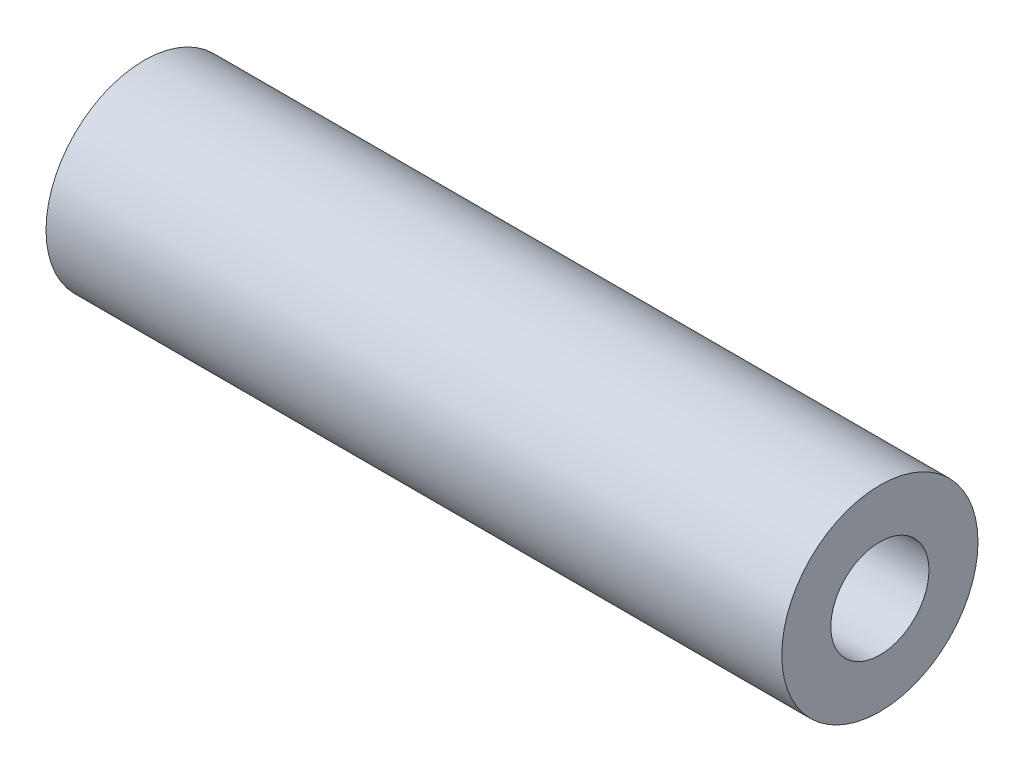
ISO-10303-21;
HEADER;
FILE_DESCRIPTION(('STEP AP214'),'2;1');
FILE_NAME('part.step','',(''),(''),'','','');
FILE_SCHEMA(('AUTOMOTIVE_DESIGN { 1 0 10303 214 1 1 1 1 }'));
ENDSEC;
DATA;
#1=APPLICATION_CONTEXT('core data for automotive mechanical design processes');
#2=APPLICATION_PROTOCOL_DEFINITION('international standard','automotive_design',2000,#1);
#3=PRODUCT_CONTEXT('',#1,'mechanical');
#4=PRODUCT('Part','Part','',(#3));
#5=PRODUCT_RELATED_PRODUCT_CATEGORY('part','',(#4));
#6=PRODUCT_DEFINITION_FORMATION('','',#4);
#7=PRODUCT_DEFINITION_CONTEXT('part definition',#1,'design');
#8=PRODUCT_DEFINITION('design','',#6,#7);
#9=PRODUCT_DEFINITION_SHAPE('','',#8);
#10=(LENGTH_UNIT() NAMED_UNIT(*) SI_UNIT(.MILLI.,.METRE.));
#11=(NAMED_UNIT(*) PLANE_ANGLE_UNIT() SI_UNIT($,.RADIAN.));
#12=(NAMED_UNIT(*) SI_UNIT($,.STERADIAN.) SOLID_ANGLE_UNIT());
#13=UNCERTAINTY_MEASURE_WITH_UNIT(LENGTH_MEASURE(1.E-05),#10,'distance_accuracy_value','');
#14=(GEOMETRIC_REPRESENTATION_CONTEXT(3) GLOBAL_UNCERTAINTY_ASSIGNED_CONTEXT((#13)) GLOBAL_UNIT_ASSIGNED_CONTEXT((#10,
#11,#12)) REPRESENTATION_CONTEXT('',''));
#15=CARTESIAN_POINT('',(0.,0.,0.));
#16=DIRECTION('',(0.,0.,1.));
#17=DIRECTION('',(1.,0.,0.));
#18=AXIS2_PLACEMENT_3D('',#15,#16,#17);
#19=CARTESIAN_POINT('',(47.625,0.,0.));
#20=DIRECTION('',(1.,0.,0.));
#21=DIRECTION('',(0.,0.,-1.));
#22=AXIS2_PLACEMENT_3D('',#19,#20,#21);
#23=PLANE('',#22);
#24=CARTESIAN_POINT('',(47.625,0.,0.));
#25=DIRECTION('',(1.,0.,0.));
#26=DIRECTION('',(0.,0.,-1.));
#27=AXIS2_PLACEMENT_3D('',#24,#25,#26);
#28=CIRCLE('',#27,6.35);
#29=CARTESIAN_POINT('',(47.625,0.,-6.35));
#30=VERTEX_POINT('',#29);
#31=EDGE_CURVE('E10',#30,#30,#28,.T.);
#32=ORIENTED_EDGE('',*,*,#31,.T.);
#33=EDGE_LOOP('',(#32));
#34=FACE_BOUND('',#33,.T.);
#35=CARTESIAN_POINT('',(47.625,0.,0.));
#36=DIRECTION('',(1.,0.,0.));
#37=DIRECTION('',(0.,0.,-1.));
#38=AXIS2_PLACEMENT_3D('',#35,#36,#37);
#39=CIRCLE('',#38,3.175);
#40=CARTESIAN_POINT('',(47.625,0.,-3.175));
#41=VERTEX_POINT('',#40);
#42=EDGE_CURVE('E44',#41,#41,#39,.T.);
#43=ORIENTED_EDGE('',*,*,#42,.F.);
#44=EDGE_LOOP('',(#43));
#45=FACE_BOUND('',#44,.T.);
#46=ADVANCED_FACE('F33',(#34,#45),#23,.T.);
#47=CARTESIAN_POINT('',(0.,0.,0.));
#48=DIRECTION('',(1.,0.,0.));
#49=DIRECTION('',(0.,0.,-1.));
#50=AXIS2_PLACEMENT_3D('',#47,#48,#49);
#51=PLANE('',#50);
#52=CARTESIAN_POINT('',(0.,0.,0.));
#53=DIRECTION('',(1.,0.,0.));
#54=DIRECTION('',(0.,0.,-1.));
#55=AXIS2_PLACEMENT_3D('',#52,#53,#54);
#56=CIRCLE('',#55,6.35);
#57=CARTESIAN_POINT('',(0.,0.,-6.35));
#58=VERTEX_POINT('',#57);
#59=EDGE_CURVE('E37',#58,#58,#56,.T.);
#60=ORIENTED_EDGE('',*,*,#59,.F.);
#61=EDGE_LOOP('',(#60));
#62=FACE_BOUND('',#61,.T.);
#63=CARTESIAN_POINT('',(0.,0.,0.));
#64=DIRECTION('',(1.,0.,0.));
#65=DIRECTION('',(0.,0.,-1.));
#66=AXIS2_PLACEMENT_3D('',#63,#64,#65);
#67=CIRCLE('',#66,3.175);
#68=CARTESIAN_POINT('',(0.,0.,-3.175));
#69=VERTEX_POINT('',#68);
#70=EDGE_CURVE('E46',#69,#69,#67,.T.);
#71=ORIENTED_EDGE('',*,*,#70,.T.);
#72=EDGE_LOOP('',(#71));
#73=FACE_BOUND('',#72,.T.);
#74=ADVANCED_FACE('F56',(#62,#73),#51,.F.);
#75=CARTESIAN_POINT('',(47.625,0.,0.));
#76=DIRECTION('',(-1.,0.,0.));
#77=DIRECTION('',(0.,0.,1.));
#78=AXIS2_PLACEMENT_3D('',#75,#76,#77);
#79=CYLINDRICAL_SURFACE('',#78,6.35);
#80=ORIENTED_EDGE('',*,*,#31,.F.);
#81=EDGE_LOOP('',(#80));
#82=FACE_BOUND('',#81,.T.);
#83=ORIENTED_EDGE('',*,*,#59,.T.);
#84=EDGE_LOOP('',(#83));
#85=FACE_BOUND('',#84,.T.);
#86=ADVANCED_FACE('F35',(#82,#85),#79,.T.);
#87=CARTESIAN_POINT('',(47.625,0.,0.));
#88=DIRECTION('',(-1.,0.,0.));
#89=DIRECTION('',(0.,0.,1.));
#90=AXIS2_PLACEMENT_3D('',#87,#88,#89);
#91=CYLINDRICAL_SURFACE('',#90,3.175);
#92=ORIENTED_EDGE('',*,*,#42,.T.);
#93=EDGE_LOOP('',(#92));
#94=FACE_BOUND('',#93,.T.);
#95=ORIENTED_EDGE('',*,*,#70,.F.);
#96=EDGE_LOOP('',(#95));
#97=FACE_BOUND('',#96,.T.);
#98=ADVANCED_FACE('F52',(#94,#97),#91,.F.);
#99=CLOSED_SHELL('',(#46,#74,#86,#98));
#100=MANIFOLD_SOLID_BREP('B2',#99);
#101=ADVANCED_BREP_SHAPE_REPRESENTATION('',(#18,#100),#14);
#102=SHAPE_DEFINITION_REPRESENTATION(#9,#101);
ENDSEC;
END-ISO-10303-21;
